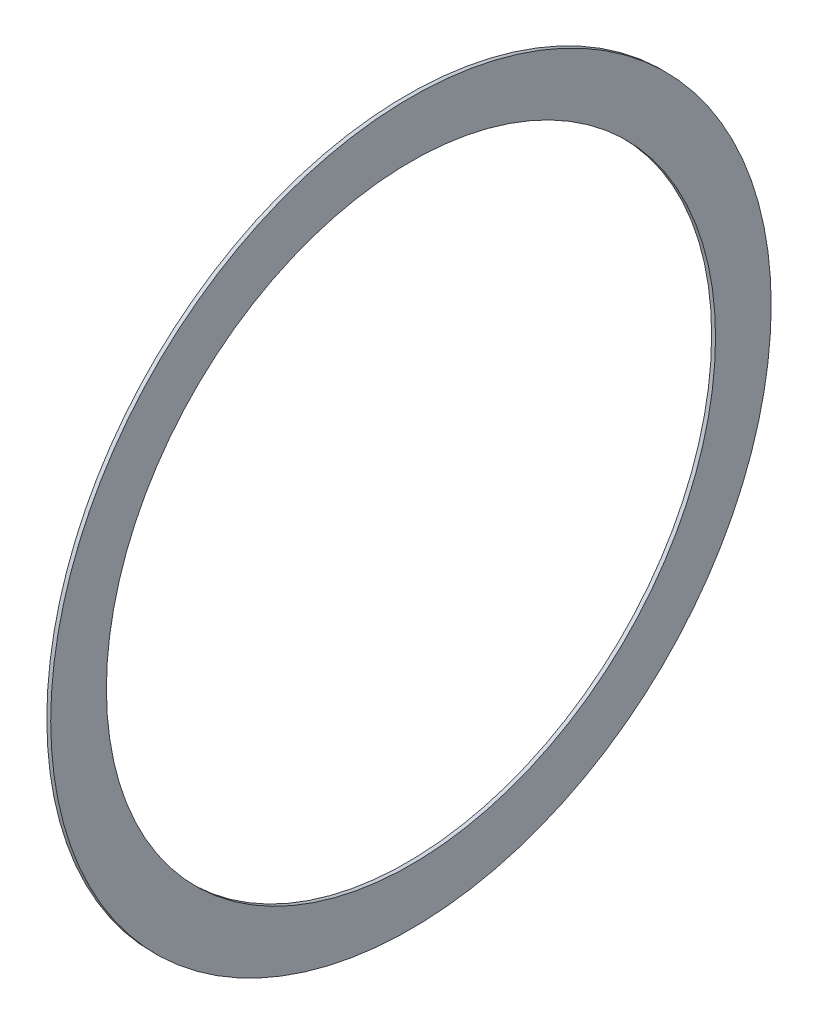
ISO-10303-21;
HEADER;
FILE_DESCRIPTION(('STEP AP214'),'2;1');
FILE_NAME('part.step','',(''),(''),'','','');
FILE_SCHEMA(('AUTOMOTIVE_DESIGN { 1 0 10303 214 1 1 1 1 }'));
ENDSEC;
DATA;
#1=APPLICATION_CONTEXT('core data for automotive mechanical design processes');
#2=APPLICATION_PROTOCOL_DEFINITION('international standard','automotive_design',2000,#1);
#3=PRODUCT_CONTEXT('',#1,'mechanical');
#4=PRODUCT('Part','Part','',(#3));
#5=PRODUCT_RELATED_PRODUCT_CATEGORY('part','',(#4));
#6=PRODUCT_DEFINITION_FORMATION('','',#4);
#7=PRODUCT_DEFINITION_CONTEXT('part definition',#1,'design');
#8=PRODUCT_DEFINITION('design','',#6,#7);
#9=PRODUCT_DEFINITION_SHAPE('','',#8);
#10=(LENGTH_UNIT() NAMED_UNIT(*) SI_UNIT(.MILLI.,.METRE.));
#11=(NAMED_UNIT(*) PLANE_ANGLE_UNIT() SI_UNIT($,.RADIAN.));
#12=(NAMED_UNIT(*) SI_UNIT($,.STERADIAN.) SOLID_ANGLE_UNIT());
#13=UNCERTAINTY_MEASURE_WITH_UNIT(LENGTH_MEASURE(1.E-05),#10,'distance_accuracy_value','');
#14=(GEOMETRIC_REPRESENTATION_CONTEXT(3) GLOBAL_UNCERTAINTY_ASSIGNED_CONTEXT((#13)) GLOBAL_UNIT_ASSIGNED_CONTEXT((#10,
#11,#12)) REPRESENTATION_CONTEXT('',''));
#15=CARTESIAN_POINT('',(0.,0.,0.));
#16=DIRECTION('',(0.,0.,1.));
#17=DIRECTION('',(1.,0.,0.));
#18=AXIS2_PLACEMENT_3D('',#15,#16,#17);
#19=CARTESIAN_POINT('',(-0.01925,0.,0.));
#20=DIRECTION('',(1.,0.,0.));
#21=DIRECTION('',(0.,0.,-1.));
#22=AXIS2_PLACEMENT_3D('',#19,#20,#21);
#23=CYLINDRICAL_SURFACE('',#22,5.488);
#24=CARTESIAN_POINT('',(-0.07875,0.,0.));
#25=DIRECTION('',(1.,0.,0.));
#26=DIRECTION('',(0.,0.,-1.));
#27=AXIS2_PLACEMENT_3D('',#24,#25,#26);
#28=CIRCLE('',#27,5.488);
#29=CARTESIAN_POINT('',(-0.07875,0.,-5.488));
#30=VERTEX_POINT('',#29);
#31=EDGE_CURVE('E29',#30,#30,#28,.T.);
#32=ORIENTED_EDGE('',*,*,#31,.T.);
#33=EDGE_LOOP('',(#32));
#34=FACE_BOUND('',#33,.T.);
#35=CARTESIAN_POINT('',(-0.01925,0.,0.));
#36=DIRECTION('',(1.,0.,0.));
#37=DIRECTION('',(0.,0.,-1.));
#38=AXIS2_PLACEMENT_3D('',#35,#36,#37);
#39=CIRCLE('',#38,5.488);
#40=CARTESIAN_POINT('',(-0.01925,0.,-5.488));
#41=VERTEX_POINT('',#40);
#42=EDGE_CURVE('E25',#41,#41,#39,.T.);
#43=ORIENTED_EDGE('',*,*,#42,.F.);
#44=EDGE_LOOP('',(#43));
#45=FACE_BOUND('',#44,.T.);
#46=ADVANCED_FACE('F14',(#34,#45),#23,.T.);
#47=CARTESIAN_POINT('',(-0.07875,5.488,0.));
#48=DIRECTION('',(-1.,0.,0.));
#49=DIRECTION('',(0.,0.,1.));
#50=AXIS2_PLACEMENT_3D('',#47,#48,#49);
#51=PLANE('',#50);
#52=CARTESIAN_POINT('',(-0.07875,0.,0.));
#53=DIRECTION('',(1.,0.,0.));
#54=DIRECTION('',(0.,0.,-1.));
#55=AXIS2_PLACEMENT_3D('',#52,#53,#54);
#56=CIRCLE('',#55,4.64);
#57=CARTESIAN_POINT('',(-0.07875,0.,-4.64));
#58=VERTEX_POINT('',#57);
#59=EDGE_CURVE('E21',#58,#58,#56,.T.);
#60=ORIENTED_EDGE('',*,*,#59,.T.);
#61=EDGE_LOOP('',(#60));
#62=FACE_BOUND('',#61,.T.);
#63=ORIENTED_EDGE('',*,*,#31,.F.);
#64=EDGE_LOOP('',(#63));
#65=FACE_BOUND('',#64,.T.);
#66=ADVANCED_FACE('F37',(#62,#65),#51,.T.);
#67=CARTESIAN_POINT('',(-0.01925,4.64,0.));
#68=DIRECTION('',(1.,0.,0.));
#69=DIRECTION('',(0.,0.,-1.));
#70=AXIS2_PLACEMENT_3D('',#67,#68,#69);
#71=PLANE('',#70);
#72=ORIENTED_EDGE('',*,*,#42,.T.);
#73=EDGE_LOOP('',(#72));
#74=FACE_BOUND('',#73,.T.);
#75=CARTESIAN_POINT('',(-0.01925,0.,0.));
#76=DIRECTION('',(1.,0.,0.));
#77=DIRECTION('',(0.,0.,-1.));
#78=AXIS2_PLACEMENT_3D('',#75,#76,#77);
#79=CIRCLE('',#78,4.64);
#80=CARTESIAN_POINT('',(-0.01925,0.,-4.64));
#81=VERTEX_POINT('',#80);
#82=EDGE_CURVE('E10',#81,#81,#79,.T.);
#83=ORIENTED_EDGE('',*,*,#82,.F.);
#84=EDGE_LOOP('',(#83));
#85=FACE_BOUND('',#84,.T.);
#86=ADVANCED_FACE('F39',(#74,#85),#71,.T.);
#87=CARTESIAN_POINT('',(-0.01925,0.,0.));
#88=DIRECTION('',(1.,0.,0.));
#89=DIRECTION('',(0.,0.,-1.));
#90=AXIS2_PLACEMENT_3D('',#87,#88,#89);
#91=CYLINDRICAL_SURFACE('',#90,4.64);
#92=ORIENTED_EDGE('',*,*,#82,.T.);
#93=EDGE_LOOP('',(#92));
#94=FACE_BOUND('',#93,.T.);
#95=ORIENTED_EDGE('',*,*,#59,.F.);
#96=EDGE_LOOP('',(#95));
#97=FACE_BOUND('',#96,.T.);
#98=ADVANCED_FACE('F16',(#94,#97),#91,.F.);
#99=CLOSED_SHELL('',(#46,#66,#86,#98));
#100=MANIFOLD_SOLID_BREP('B1',#99);
#101=ADVANCED_BREP_SHAPE_REPRESENTATION('',(#18,#100),#14);
#102=SHAPE_DEFINITION_REPRESENTATION(#9,#101);
ENDSEC;
END-ISO-10303-21;
